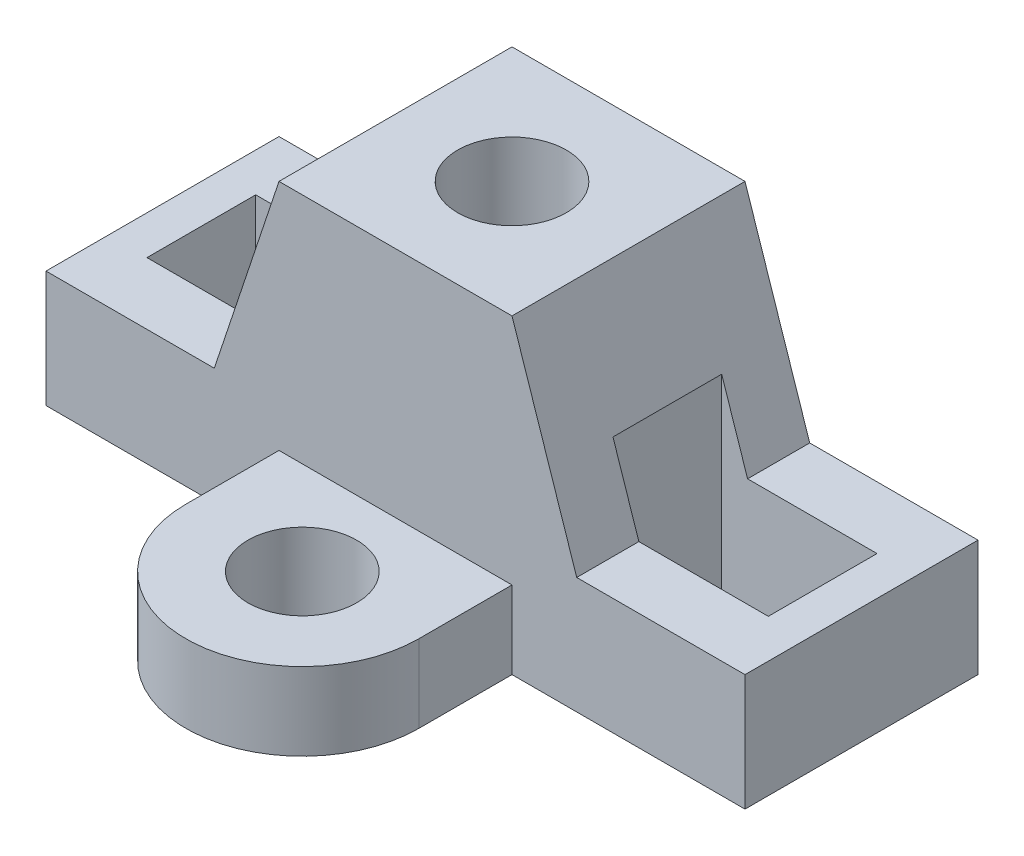
ISO-10303-21;
HEADER;
FILE_DESCRIPTION(('STEP AP214'),'2;1');
FILE_NAME('part.step','',(''),(''),'','','');
FILE_SCHEMA(('AUTOMOTIVE_DESIGN { 1 0 10303 214 1 1 1 1 }'));
ENDSEC;
DATA;
#1=APPLICATION_CONTEXT('core data for automotive mechanical design processes');
#2=APPLICATION_PROTOCOL_DEFINITION('international standard','automotive_design',2000,#1);
#3=PRODUCT_CONTEXT('',#1,'mechanical');
#4=PRODUCT('Part','Part','',(#3));
#5=PRODUCT_RELATED_PRODUCT_CATEGORY('part','',(#4));
#6=PRODUCT_DEFINITION_FORMATION('','',#4);
#7=PRODUCT_DEFINITION_CONTEXT('part definition',#1,'design');
#8=PRODUCT_DEFINITION('design','',#6,#7);
#9=PRODUCT_DEFINITION_SHAPE('','',#8);
#10=(LENGTH_UNIT() NAMED_UNIT(*) SI_UNIT(.MILLI.,.METRE.));
#11=(NAMED_UNIT(*) PLANE_ANGLE_UNIT() SI_UNIT($,.RADIAN.));
#12=(NAMED_UNIT(*) SI_UNIT($,.STERADIAN.) SOLID_ANGLE_UNIT());
#13=UNCERTAINTY_MEASURE_WITH_UNIT(LENGTH_MEASURE(1.E-05),#10,'distance_accuracy_value','');
#14=(GEOMETRIC_REPRESENTATION_CONTEXT(3) GLOBAL_UNCERTAINTY_ASSIGNED_CONTEXT((#13)) GLOBAL_UNIT_ASSIGNED_CONTEXT((#10,
#11,#12)) REPRESENTATION_CONTEXT('',''));
#15=CARTESIAN_POINT('',(0.,0.,0.));
#16=DIRECTION('',(0.,0.,1.));
#17=DIRECTION('',(1.,0.,0.));
#18=AXIS2_PLACEMENT_3D('',#15,#16,#17);
#19=CARTESIAN_POINT('',(15.,10.,0.));
#20=DIRECTION('',(-1.,0.,0.));
#21=DIRECTION('',(0.,0.,1.));
#22=AXIS2_PLACEMENT_3D('',#19,#20,#21);
#23=PLANE('',#22);
#24=DIRECTION('',(0.,-1.,0.));
#25=VECTOR('',#24,1.);
#26=CARTESIAN_POINT('',(15.,40.,-12.));
#27=LINE('',#26,#25);
#28=CARTESIAN_POINT('',(15.,10.,-12.));
#29=VERTEX_POINT('',#28);
#30=CARTESIAN_POINT('',(15.,0.,-12.));
#31=VERTEX_POINT('',#30);
#32=EDGE_CURVE('E268',#29,#31,#27,.T.);
#33=ORIENTED_EDGE('',*,*,#32,.F.);
#34=DIRECTION('',(0.,0.,-1.));
#35=VECTOR('',#34,1.);
#36=CARTESIAN_POINT('',(15.,10.,0.));
#37=LINE('',#36,#35);
#38=CARTESIAN_POINT('',(15.,10.,0.));
#39=VERTEX_POINT('',#38);
#40=EDGE_CURVE('E326',#39,#29,#37,.T.);
#41=ORIENTED_EDGE('',*,*,#40,.F.);
#42=DIRECTION('',(0.,-1.,0.));
#43=VECTOR('',#42,1.);
#44=CARTESIAN_POINT('',(15.,10.,0.));
#45=LINE('',#44,#43);
#46=CARTESIAN_POINT('',(15.,0.,0.));
#47=VERTEX_POINT('',#46);
#48=EDGE_CURVE('E332',#39,#47,#45,.T.);
#49=ORIENTED_EDGE('',*,*,#48,.T.);
#50=DIRECTION('',(0.,0.,-1.));
#51=VECTOR('',#50,1.);
#52=CARTESIAN_POINT('',(15.,0.,0.));
#53=LINE('',#52,#51);
#54=EDGE_CURVE('E321',#47,#31,#53,.T.);
#55=ORIENTED_EDGE('',*,*,#54,.T.);
#56=EDGE_LOOP('',(#33,#41,#49,#55));
#57=FACE_BOUND('',#56,.T.);
#58=ADVANCED_FACE('F41',(#57),#23,.F.);
#59=CARTESIAN_POINT('',(-15.,10.,0.));
#60=DIRECTION('',(-1.,0.,0.));
#61=DIRECTION('',(0.,0.,1.));
#62=AXIS2_PLACEMENT_3D('',#59,#60,#61);
#63=PLANE('',#62);
#64=DIRECTION('',(0.,-1.,0.));
#65=VECTOR('',#64,1.);
#66=CARTESIAN_POINT('',(-15.,40.,-12.));
#67=LINE('',#66,#65);
#68=CARTESIAN_POINT('',(-15.,10.,-12.));
#69=VERTEX_POINT('',#68);
#70=CARTESIAN_POINT('',(-15.,0.,-12.));
#71=VERTEX_POINT('',#70);
#72=EDGE_CURVE('E300',#69,#71,#67,.T.);
#73=ORIENTED_EDGE('',*,*,#72,.T.);
#74=DIRECTION('',(0.,0.,-1.));
#75=VECTOR('',#74,1.);
#76=CARTESIAN_POINT('',(-15.,0.,0.));
#77=LINE('',#76,#75);
#78=CARTESIAN_POINT('',(-15.,0.,0.));
#79=VERTEX_POINT('',#78);
#80=EDGE_CURVE('E335',#79,#71,#77,.T.);
#81=ORIENTED_EDGE('',*,*,#80,.F.);
#82=DIRECTION('',(0.,-1.,0.));
#83=VECTOR('',#82,1.);
#84=CARTESIAN_POINT('',(-15.,10.,0.));
#85=LINE('',#84,#83);
#86=CARTESIAN_POINT('',(-15.,10.,0.));
#87=VERTEX_POINT('',#86);
#88=EDGE_CURVE('E344',#87,#79,#85,.T.);
#89=ORIENTED_EDGE('',*,*,#88,.F.);
#90=DIRECTION('',(0.,0.,-1.));
#91=VECTOR('',#90,1.);
#92=CARTESIAN_POINT('',(-15.,10.,0.));
#93=LINE('',#92,#91);
#94=EDGE_CURVE('E320',#87,#69,#93,.T.);
#95=ORIENTED_EDGE('',*,*,#94,.T.);
#96=EDGE_LOOP('',(#73,#81,#89,#95));
#97=FACE_BOUND('',#96,.T.);
#98=ADVANCED_FACE('F428',(#97),#63,.T.);
#99=CARTESIAN_POINT('',(0.,10.,0.));
#100=DIRECTION('',(0.,-1.,0.));
#101=DIRECTION('',(0.,0.,-1.));
#102=AXIS2_PLACEMENT_3D('',#99,#100,#101);
#103=CYLINDRICAL_SURFACE('',#102,15.);
#104=CARTESIAN_POINT('',(0.,0.,0.));
#105=DIRECTION('',(0.,1.,0.));
#106=DIRECTION('',(0.,0.,1.));
#107=AXIS2_PLACEMENT_3D('',#104,#105,#106);
#108=CIRCLE('',#107,15.);
#109=EDGE_CURVE('E338',#79,#47,#108,.T.);
#110=ORIENTED_EDGE('',*,*,#109,.T.);
#111=ORIENTED_EDGE('',*,*,#48,.F.);
#112=CARTESIAN_POINT('',(0.,10.,0.));
#113=DIRECTION('',(0.,1.,0.));
#114=DIRECTION('',(0.,0.,1.));
#115=AXIS2_PLACEMENT_3D('',#112,#113,#114);
#116=CIRCLE('',#115,15.);
#117=EDGE_CURVE('E323',#87,#39,#116,.T.);
#118=ORIENTED_EDGE('',*,*,#117,.F.);
#119=ORIENTED_EDGE('',*,*,#88,.T.);
#120=EDGE_LOOP('',(#110,#111,#118,#119));
#121=FACE_BOUND('',#120,.T.);
#122=ADVANCED_FACE('F433',(#121),#103,.T.);
#123=CARTESIAN_POINT('',(0.,10.,0.));
#124=DIRECTION('',(0.,-1.,0.));
#125=DIRECTION('',(0.,0.,-1.));
#126=AXIS2_PLACEMENT_3D('',#123,#124,#125);
#127=CYLINDRICAL_SURFACE('',#126,7.);
#128=CARTESIAN_POINT('',(0.,10.,0.));
#129=DIRECTION('',(0.,1.,0.));
#130=DIRECTION('',(0.,0.,1.));
#131=AXIS2_PLACEMENT_3D('',#128,#129,#130);
#132=CIRCLE('',#131,7.);
#133=CARTESIAN_POINT('',(0.,10.,7.));
#134=VERTEX_POINT('',#133);
#135=EDGE_CURVE('E317',#134,#134,#132,.T.);
#136=ORIENTED_EDGE('',*,*,#135,.T.);
#137=EDGE_LOOP('',(#136));
#138=FACE_BOUND('',#137,.T.);
#139=CARTESIAN_POINT('',(0.,0.,0.));
#140=DIRECTION('',(0.,1.,0.));
#141=DIRECTION('',(0.,0.,1.));
#142=AXIS2_PLACEMENT_3D('',#139,#140,#141);
#143=CIRCLE('',#142,7.);
#144=CARTESIAN_POINT('',(0.,0.,7.));
#145=VERTEX_POINT('',#144);
#146=EDGE_CURVE('E313',#145,#145,#143,.T.);
#147=ORIENTED_EDGE('',*,*,#146,.F.);
#148=EDGE_LOOP('',(#147));
#149=FACE_BOUND('',#148,.T.);
#150=ADVANCED_FACE('F423',(#138,#149),#127,.F.);
#151=CARTESIAN_POINT('',(0.,10.,0.));
#152=DIRECTION('',(0.,1.,0.));
#153=DIRECTION('',(0.,0.,1.));
#154=AXIS2_PLACEMENT_3D('',#151,#152,#153);
#155=PLANE('',#154);
#156=ORIENTED_EDGE('',*,*,#135,.F.);
#157=EDGE_LOOP('',(#156));
#158=FACE_BOUND('',#157,.T.);
#159=ORIENTED_EDGE('',*,*,#94,.F.);
#160=ORIENTED_EDGE('',*,*,#117,.T.);
#161=ORIENTED_EDGE('',*,*,#40,.T.);
#162=DIRECTION('',(1.,0.,0.));
#163=VECTOR('',#162,1.);
#164=CARTESIAN_POINT('',(0.,10.,-12.));
#165=LINE('',#164,#163);
#166=EDGE_CURVE('E329',#69,#29,#165,.T.);
#167=ORIENTED_EDGE('',*,*,#166,.F.);
#168=EDGE_LOOP('',(#159,#160,#161,#167));
#169=FACE_BOUND('',#168,.T.);
#170=ADVANCED_FACE('F416',(#158,#169),#155,.T.);
#171=CARTESIAN_POINT('',(0.,0.,0.));
#172=DIRECTION('',(0.,1.,0.));
#173=DIRECTION('',(0.,0.,1.));
#174=AXIS2_PLACEMENT_3D('',#171,#172,#173);
#175=PLANE('',#174);
#176=DIRECTION('',(1.,0.,0.));
#177=VECTOR('',#176,1.);
#178=CARTESIAN_POINT('',(0.,0.,-34.));
#179=LINE('',#178,#177);
#180=CARTESIAN_POINT('',(20.,0.,-34.));
#181=VERTEX_POINT('',#180);
#182=CARTESIAN_POINT('',(40.,0.,-34.));
#183=VERTEX_POINT('',#182);
#184=EDGE_CURVE('E226',#181,#183,#179,.T.);
#185=ORIENTED_EDGE('',*,*,#184,.F.);
#186=DIRECTION('',(0.,0.,-1.));
#187=VECTOR('',#186,1.);
#188=CARTESIAN_POINT('',(20.,0.,-20.));
#189=LINE('',#188,#187);
#190=CARTESIAN_POINT('',(20.,0.,-20.));
#191=VERTEX_POINT('',#190);
#192=EDGE_CURVE('E220',#191,#181,#189,.T.);
#193=ORIENTED_EDGE('',*,*,#192,.F.);
#194=DIRECTION('',(-1.,0.,0.));
#195=VECTOR('',#194,1.);
#196=CARTESIAN_POINT('',(0.,0.,-20.));
#197=LINE('',#196,#195);
#198=CARTESIAN_POINT('',(40.,0.,-20.));
#199=VERTEX_POINT('',#198);
#200=EDGE_CURVE('E251',#199,#191,#197,.T.);
#201=ORIENTED_EDGE('',*,*,#200,.F.);
#202=DIRECTION('',(0.,0.,1.));
#203=VECTOR('',#202,1.);
#204=CARTESIAN_POINT('',(40.,0.,0.));
#205=LINE('',#204,#203);
#206=EDGE_CURVE('E249',#183,#199,#205,.T.);
#207=ORIENTED_EDGE('',*,*,#206,.F.);
#208=EDGE_LOOP('',(#185,#193,#201,#207));
#209=FACE_BOUND('',#208,.T.);
#210=DIRECTION('',(1.,0.,0.));
#211=VECTOR('',#210,1.);
#212=CARTESIAN_POINT('',(0.,0.,-20.));
#213=LINE('',#212,#211);
#214=CARTESIAN_POINT('',(-40.,0.,-20.));
#215=VERTEX_POINT('',#214);
#216=CARTESIAN_POINT('',(-20.,0.,-20.));
#217=VERTEX_POINT('',#216);
#218=EDGE_CURVE('E218',#215,#217,#213,.T.);
#219=ORIENTED_EDGE('',*,*,#218,.T.);
#220=DIRECTION('',(0.,0.,1.));
#221=VECTOR('',#220,1.);
#222=CARTESIAN_POINT('',(-20.,0.,-20.));
#223=LINE('',#222,#221);
#224=CARTESIAN_POINT('',(-20.,0.,-34.));
#225=VERTEX_POINT('',#224);
#226=EDGE_CURVE('E210',#225,#217,#223,.T.);
#227=ORIENTED_EDGE('',*,*,#226,.F.);
#228=DIRECTION('',(1.,0.,0.));
#229=VECTOR('',#228,1.);
#230=CARTESIAN_POINT('',(0.,0.,-34.));
#231=LINE('',#230,#229);
#232=CARTESIAN_POINT('',(-40.,0.,-34.));
#233=VERTEX_POINT('',#232);
#234=EDGE_CURVE('E193',#233,#225,#231,.T.);
#235=ORIENTED_EDGE('',*,*,#234,.F.);
#236=DIRECTION('',(0.,0.,1.));
#237=VECTOR('',#236,1.);
#238=CARTESIAN_POINT('',(-40.,0.,0.));
#239=LINE('',#238,#237);
#240=EDGE_CURVE('E204',#233,#215,#239,.T.);
#241=ORIENTED_EDGE('',*,*,#240,.T.);
#242=EDGE_LOOP('',(#219,#227,#235,#241));
#243=FACE_BOUND('',#242,.T.);
#244=ORIENTED_EDGE('',*,*,#146,.T.);
#245=EDGE_LOOP('',(#244));
#246=FACE_BOUND('',#245,.T.);
#247=ORIENTED_EDGE('',*,*,#80,.T.);
#248=DIRECTION('',(-1.,0.,0.));
#249=VECTOR('',#248,1.);
#250=CARTESIAN_POINT('',(0.,0.,-12.));
#251=LINE('',#250,#249);
#252=CARTESIAN_POINT('',(-45.,0.,-12.));
#253=VERTEX_POINT('',#252);
#254=EDGE_CURVE('E298',#71,#253,#251,.T.);
#255=ORIENTED_EDGE('',*,*,#254,.T.);
#256=DIRECTION('',(0.,0.,-1.));
#257=VECTOR('',#256,1.);
#258=CARTESIAN_POINT('',(-45.,0.,0.));
#259=LINE('',#258,#257);
#260=CARTESIAN_POINT('',(-45.,0.,-42.));
#261=VERTEX_POINT('',#260);
#262=EDGE_CURVE('E203',#253,#261,#259,.T.);
#263=ORIENTED_EDGE('',*,*,#262,.T.);
#264=DIRECTION('',(1.,0.,0.));
#265=VECTOR('',#264,1.);
#266=CARTESIAN_POINT('',(0.,0.,-42.));
#267=LINE('',#266,#265);
#268=CARTESIAN_POINT('',(45.,0.,-42.));
#269=VERTEX_POINT('',#268);
#270=EDGE_CURVE('E307',#261,#269,#267,.T.);
#271=ORIENTED_EDGE('',*,*,#270,.T.);
#272=DIRECTION('',(0.,0.,1.));
#273=VECTOR('',#272,1.);
#274=CARTESIAN_POINT('',(45.,0.,0.));
#275=LINE('',#274,#273);
#276=CARTESIAN_POINT('',(45.,0.,-12.));
#277=VERTEX_POINT('',#276);
#278=EDGE_CURVE('E236',#269,#277,#275,.T.);
#279=ORIENTED_EDGE('',*,*,#278,.T.);
#280=DIRECTION('',(1.,0.,0.));
#281=VECTOR('',#280,1.);
#282=CARTESIAN_POINT('',(0.,0.,-12.));
#283=LINE('',#282,#281);
#284=EDGE_CURVE('E266',#31,#277,#283,.T.);
#285=ORIENTED_EDGE('',*,*,#284,.F.);
#286=ORIENTED_EDGE('',*,*,#54,.F.);
#287=ORIENTED_EDGE('',*,*,#109,.F.);
#288=EDGE_LOOP('',(#247,#255,#263,#271,#279,#285,#286,#287));
#289=FACE_BOUND('',#288,.T.);
#290=CARTESIAN_POINT('',(0.,0.,-27.));
#291=DIRECTION('',(0.,1.,0.));
#292=DIRECTION('',(0.,0.,1.));
#293=AXIS2_PLACEMENT_3D('',#290,#291,#292);
#294=CIRCLE('',#293,7.);
#295=CARTESIAN_POINT('',(0.,0.,-20.));
#296=VERTEX_POINT('',#295);
#297=EDGE_CURVE('E302',#296,#296,#294,.T.);
#298=ORIENTED_EDGE('',*,*,#297,.T.);
#299=EDGE_LOOP('',(#298));
#300=FACE_BOUND('',#299,.T.);
#301=ADVANCED_FACE('F215',(#209,#243,#246,#289,#300),#175,.F.);
#302=CARTESIAN_POINT('',(0.,40.,-12.));
#303=DIRECTION('',(0.,0.,-1.));
#304=DIRECTION('',(-1.,0.,0.));
#305=AXIS2_PLACEMENT_3D('',#302,#303,#304);
#306=PLANE('',#305);
#307=DIRECTION('',(1.,0.,0.));
#308=VECTOR('',#307,1.);
#309=CARTESIAN_POINT('',(0.,15.,-12.));
#310=LINE('',#309,#308);
#311=CARTESIAN_POINT('',(23.3333333333333,15.,-12.));
#312=VERTEX_POINT('',#311);
#313=CARTESIAN_POINT('',(45.,15.,-12.));
#314=VERTEX_POINT('',#313);
#315=EDGE_CURVE('E239',#312,#314,#310,.T.);
#316=ORIENTED_EDGE('',*,*,#315,.F.);
#317=DIRECTION('',(0.316227766016843,-0.948683298050512,0.));
#318=VECTOR('',#317,1.);
#319=CARTESIAN_POINT('',(25.,9.99999999999993,-12.));
#320=LINE('',#319,#318);
#321=CARTESIAN_POINT('',(14.9999999999998,40.,-12.));
#322=VERTEX_POINT('',#321);
#323=EDGE_CURVE('E349',#312,#322,#320,.F.);
#324=ORIENTED_EDGE('',*,*,#323,.T.);
#325=DIRECTION('',(1.,0.,0.));
#326=VECTOR('',#325,1.);
#327=CARTESIAN_POINT('',(0.,40.,-12.));
#328=LINE('',#327,#326);
#329=CARTESIAN_POINT('',(-15.,40.,-12.));
#330=VERTEX_POINT('',#329);
#331=EDGE_CURVE('E310',#330,#322,#328,.T.);
#332=ORIENTED_EDGE('',*,*,#331,.F.);
#333=DIRECTION('',(-0.316227766016836,-0.948683298050515,0.));
#334=VECTOR('',#333,1.);
#335=CARTESIAN_POINT('',(-15.,40.,-12.));
#336=LINE('',#335,#334);
#337=CARTESIAN_POINT('',(-23.3333333333332,15.,-12.));
#338=VERTEX_POINT('',#337);
#339=EDGE_CURVE('E346',#330,#338,#336,.T.);
#340=ORIENTED_EDGE('',*,*,#339,.T.);
#341=DIRECTION('',(-1.,0.,0.));
#342=VECTOR('',#341,1.);
#343=CARTESIAN_POINT('',(0.,15.,-12.));
#344=LINE('',#343,#342);
#345=CARTESIAN_POINT('',(-45.,15.,-12.));
#346=VERTEX_POINT('',#345);
#347=EDGE_CURVE('E282',#338,#346,#344,.T.);
#348=ORIENTED_EDGE('',*,*,#347,.T.);
#349=DIRECTION('',(0.,-1.,0.));
#350=VECTOR('',#349,1.);
#351=CARTESIAN_POINT('',(-45.,15.,-12.));
#352=LINE('',#351,#350);
#353=EDGE_CURVE('E285',#346,#253,#352,.T.);
#354=ORIENTED_EDGE('',*,*,#353,.T.);
#355=ORIENTED_EDGE('',*,*,#254,.F.);
#356=ORIENTED_EDGE('',*,*,#72,.F.);
#357=ORIENTED_EDGE('',*,*,#166,.T.);
#358=ORIENTED_EDGE('',*,*,#32,.T.);
#359=ORIENTED_EDGE('',*,*,#284,.T.);
#360=DIRECTION('',(0.,-1.,0.));
#361=VECTOR('',#360,1.);
#362=CARTESIAN_POINT('',(45.,15.,-12.));
#363=LINE('',#362,#361);
#364=EDGE_CURVE('E257',#314,#277,#363,.T.);
#365=ORIENTED_EDGE('',*,*,#364,.F.);
#366=EDGE_LOOP('',(#316,#324,#332,#340,#348,#354,#355,#356,#357,#358,#359,#365));
#367=FACE_BOUND('',#366,.T.);
#368=ADVANCED_FACE('F396',(#367),#306,.F.);
#369=CARTESIAN_POINT('',(0.,40.,-42.));
#370=DIRECTION('',(0.,0.,-1.));
#371=DIRECTION('',(-1.,0.,0.));
#372=AXIS2_PLACEMENT_3D('',#369,#370,#371);
#373=PLANE('',#372);
#374=DIRECTION('',(-0.316227766016843,0.948683298050512,0.));
#375=VECTOR('',#374,1.);
#376=CARTESIAN_POINT('',(13.4999999999998,44.5,-42.));
#377=LINE('',#376,#375);
#378=CARTESIAN_POINT('',(14.9999999999998,40.,-42.));
#379=VERTEX_POINT('',#378);
#380=CARTESIAN_POINT('',(23.3333333333333,15.,-42.));
#381=VERTEX_POINT('',#380);
#382=EDGE_CURVE('E358',#379,#381,#377,.F.);
#383=ORIENTED_EDGE('',*,*,#382,.T.);
#384=DIRECTION('',(1.,0.,0.));
#385=VECTOR('',#384,1.);
#386=CARTESIAN_POINT('',(0.,15.,-42.));
#387=LINE('',#386,#385);
#388=CARTESIAN_POINT('',(45.,15.,-42.));
#389=VERTEX_POINT('',#388);
#390=EDGE_CURVE('E244',#381,#389,#387,.T.);
#391=ORIENTED_EDGE('',*,*,#390,.T.);
#392=DIRECTION('',(0.,-1.,0.));
#393=VECTOR('',#392,1.);
#394=CARTESIAN_POINT('',(45.,15.,-42.));
#395=LINE('',#394,#393);
#396=EDGE_CURVE('E247',#389,#269,#395,.T.);
#397=ORIENTED_EDGE('',*,*,#396,.T.);
#398=ORIENTED_EDGE('',*,*,#270,.F.);
#399=DIRECTION('',(0.,-1.,0.));
#400=VECTOR('',#399,1.);
#401=CARTESIAN_POINT('',(-45.,15.,-42.));
#402=LINE('',#401,#400);
#403=CARTESIAN_POINT('',(-45.,15.,-42.));
#404=VERTEX_POINT('',#403);
#405=EDGE_CURVE('E292',#404,#261,#402,.T.);
#406=ORIENTED_EDGE('',*,*,#405,.F.);
#407=DIRECTION('',(1.,0.,0.));
#408=VECTOR('',#407,1.);
#409=CARTESIAN_POINT('',(0.,15.,-42.));
#410=LINE('',#409,#408);
#411=CARTESIAN_POINT('',(-23.3333333333332,15.,-42.));
#412=VERTEX_POINT('',#411);
#413=EDGE_CURVE('E277',#404,#412,#410,.T.);
#414=ORIENTED_EDGE('',*,*,#413,.T.);
#415=DIRECTION('',(0.316227766016836,0.948683298050515,0.));
#416=VECTOR('',#415,1.);
#417=CARTESIAN_POINT('',(-13.5,44.5,-42.));
#418=LINE('',#417,#416);
#419=CARTESIAN_POINT('',(-15.,40.,-42.));
#420=VERTEX_POINT('',#419);
#421=EDGE_CURVE('E356',#412,#420,#418,.T.);
#422=ORIENTED_EDGE('',*,*,#421,.T.);
#423=DIRECTION('',(1.,0.,0.));
#424=VECTOR('',#423,1.);
#425=CARTESIAN_POINT('',(0.,40.,-42.));
#426=LINE('',#425,#424);
#427=EDGE_CURVE('E306',#420,#379,#426,.T.);
#428=ORIENTED_EDGE('',*,*,#427,.T.);
#429=EDGE_LOOP('',(#383,#391,#397,#398,#406,#414,#422,#428));
#430=FACE_BOUND('',#429,.T.);
#431=ADVANCED_FACE('F402',(#430),#373,.T.);
#432=CARTESIAN_POINT('',(0.,40.,-27.));
#433=DIRECTION('',(0.,-1.,0.));
#434=DIRECTION('',(0.,0.,-1.));
#435=AXIS2_PLACEMENT_3D('',#432,#433,#434);
#436=CYLINDRICAL_SURFACE('',#435,7.);
#437=CARTESIAN_POINT('',(0.,40.,-27.));
#438=DIRECTION('',(0.,1.,0.));
#439=DIRECTION('',(0.,0.,1.));
#440=AXIS2_PLACEMENT_3D('',#437,#438,#439);
#441=CIRCLE('',#440,7.);
#442=CARTESIAN_POINT('',(0.,40.,-20.));
#443=VERTEX_POINT('',#442);
#444=EDGE_CURVE('E303',#443,#443,#441,.T.);
#445=ORIENTED_EDGE('',*,*,#444,.T.);
#446=EDGE_LOOP('',(#445));
#447=FACE_BOUND('',#446,.T.);
#448=ORIENTED_EDGE('',*,*,#297,.F.);
#449=EDGE_LOOP('',(#448));
#450=FACE_BOUND('',#449,.T.);
#451=ADVANCED_FACE('F484',(#447,#450),#436,.F.);
#452=CARTESIAN_POINT('',(0.,40.,0.));
#453=DIRECTION('',(0.,1.,0.));
#454=DIRECTION('',(0.,0.,1.));
#455=AXIS2_PLACEMENT_3D('',#452,#453,#454);
#456=PLANE('',#455);
#457=ORIENTED_EDGE('',*,*,#444,.F.);
#458=EDGE_LOOP('',(#457));
#459=FACE_BOUND('',#458,.T.);
#460=ORIENTED_EDGE('',*,*,#331,.T.);
#461=DIRECTION('',(0.,0.,-1.));
#462=VECTOR('',#461,1.);
#463=CARTESIAN_POINT('',(14.9999999999998,40.,0.));
#464=LINE('',#463,#462);
#465=EDGE_CURVE('E354',#322,#379,#464,.T.);
#466=ORIENTED_EDGE('',*,*,#465,.T.);
#467=ORIENTED_EDGE('',*,*,#427,.F.);
#468=DIRECTION('',(0.,0.,1.));
#469=VECTOR('',#468,1.);
#470=CARTESIAN_POINT('',(-15.,40.,-12.));
#471=LINE('',#470,#469);
#472=EDGE_CURVE('E351',#420,#330,#471,.T.);
#473=ORIENTED_EDGE('',*,*,#472,.T.);
#474=EDGE_LOOP('',(#460,#466,#467,#473));
#475=FACE_BOUND('',#474,.T.);
#476=ADVANCED_FACE('F481',(#459,#475),#456,.T.);
#477=CARTESIAN_POINT('',(0.,15.,-20.));
#478=DIRECTION('',(0.,0.,-1.));
#479=DIRECTION('',(-1.,0.,0.));
#480=AXIS2_PLACEMENT_3D('',#477,#478,#479);
#481=PLANE('',#480);
#482=DIRECTION('',(0.,-1.,0.));
#483=VECTOR('',#482,1.);
#484=CARTESIAN_POINT('',(-20.,40.,-20.));
#485=LINE('',#484,#483);
#486=CARTESIAN_POINT('',(-20.,24.9999999999998,-20.));
#487=VERTEX_POINT('',#486);
#488=EDGE_CURVE('E213',#487,#217,#485,.T.);
#489=ORIENTED_EDGE('',*,*,#488,.T.);
#490=ORIENTED_EDGE('',*,*,#218,.F.);
#491=DIRECTION('',(0.,-1.,0.));
#492=VECTOR('',#491,1.);
#493=CARTESIAN_POINT('',(-40.,15.,-20.));
#494=LINE('',#493,#492);
#495=CARTESIAN_POINT('',(-40.,15.,-20.));
#496=VERTEX_POINT('',#495);
#497=EDGE_CURVE('E296',#496,#215,#494,.T.);
#498=ORIENTED_EDGE('',*,*,#497,.F.);
#499=DIRECTION('',(1.,0.,0.));
#500=VECTOR('',#499,1.);
#501=CARTESIAN_POINT('',(0.,15.,-20.));
#502=LINE('',#501,#500);
#503=CARTESIAN_POINT('',(-23.3333333333332,15.,-20.));
#504=VERTEX_POINT('',#503);
#505=EDGE_CURVE('E271',#496,#504,#502,.T.);
#506=ORIENTED_EDGE('',*,*,#505,.T.);
#507=DIRECTION('',(0.316227766016836,0.948683298050515,0.));
#508=VECTOR('',#507,1.);
#509=CARTESIAN_POINT('',(-15.,40.,-20.));
#510=LINE('',#509,#508);
#511=EDGE_CURVE('E374',#504,#487,#510,.T.);
#512=ORIENTED_EDGE('',*,*,#511,.T.);
#513=EDGE_LOOP('',(#489,#490,#498,#506,#512));
#514=FACE_BOUND('',#513,.T.);
#515=ADVANCED_FACE('F477',(#514),#481,.T.);
#516=CARTESIAN_POINT('',(-40.,15.,0.));
#517=DIRECTION('',(1.,0.,0.));
#518=DIRECTION('',(0.,0.,-1.));
#519=AXIS2_PLACEMENT_3D('',#516,#517,#518);
#520=PLANE('',#519);
#521=ORIENTED_EDGE('',*,*,#240,.F.);
#522=DIRECTION('',(0.,-1.,0.));
#523=VECTOR('',#522,1.);
#524=CARTESIAN_POINT('',(-40.,15.,-34.));
#525=LINE('',#524,#523);
#526=CARTESIAN_POINT('',(-40.,15.,-34.));
#527=VERTEX_POINT('',#526);
#528=EDGE_CURVE('E198',#527,#233,#525,.T.);
#529=ORIENTED_EDGE('',*,*,#528,.F.);
#530=DIRECTION('',(0.,0.,1.));
#531=VECTOR('',#530,1.);
#532=CARTESIAN_POINT('',(-40.,15.,0.));
#533=LINE('',#532,#531);
#534=EDGE_CURVE('E273',#527,#496,#533,.T.);
#535=ORIENTED_EDGE('',*,*,#534,.T.);
#536=ORIENTED_EDGE('',*,*,#497,.T.);
#537=EDGE_LOOP('',(#521,#529,#535,#536));
#538=FACE_BOUND('',#537,.T.);
#539=ADVANCED_FACE('F474',(#538),#520,.T.);
#540=CARTESIAN_POINT('',(0.,15.,-34.));
#541=DIRECTION('',(0.,0.,-1.));
#542=DIRECTION('',(-1.,0.,0.));
#543=AXIS2_PLACEMENT_3D('',#540,#541,#542);
#544=PLANE('',#543);
#545=ORIENTED_EDGE('',*,*,#234,.T.);
#546=DIRECTION('',(0.,-1.,0.));
#547=VECTOR('',#546,1.);
#548=CARTESIAN_POINT('',(-20.,40.,-34.));
#549=LINE('',#548,#547);
#550=CARTESIAN_POINT('',(-20.,24.9999999999998,-34.));
#551=VERTEX_POINT('',#550);
#552=EDGE_CURVE('E196',#551,#225,#549,.T.);
#553=ORIENTED_EDGE('',*,*,#552,.F.);
#554=DIRECTION('',(-0.316227766016836,-0.948683298050515,0.));
#555=VECTOR('',#554,1.);
#556=CARTESIAN_POINT('',(-15.,40.,-34.));
#557=LINE('',#556,#555);
#558=CARTESIAN_POINT('',(-23.3333333333332,15.,-34.));
#559=VERTEX_POINT('',#558);
#560=EDGE_CURVE('E371',#551,#559,#557,.T.);
#561=ORIENTED_EDGE('',*,*,#560,.T.);
#562=DIRECTION('',(1.,0.,0.));
#563=VECTOR('',#562,1.);
#564=CARTESIAN_POINT('',(0.,15.,-34.));
#565=LINE('',#564,#563);
#566=EDGE_CURVE('E57',#527,#559,#565,.T.);
#567=ORIENTED_EDGE('',*,*,#566,.F.);
#568=ORIENTED_EDGE('',*,*,#528,.T.);
#569=EDGE_LOOP('',(#545,#553,#561,#567,#568));
#570=FACE_BOUND('',#569,.T.);
#571=ADVANCED_FACE('F195',(#570),#544,.F.);
#572=CARTESIAN_POINT('',(-45.,15.,0.));
#573=DIRECTION('',(-1.,0.,0.));
#574=DIRECTION('',(0.,0.,1.));
#575=AXIS2_PLACEMENT_3D('',#572,#573,#574);
#576=PLANE('',#575);
#577=ORIENTED_EDGE('',*,*,#262,.F.);
#578=ORIENTED_EDGE('',*,*,#353,.F.);
#579=DIRECTION('',(0.,0.,-1.));
#580=VECTOR('',#579,1.);
#581=CARTESIAN_POINT('',(-45.,15.,0.));
#582=LINE('',#581,#580);
#583=EDGE_CURVE('E279',#346,#404,#582,.T.);
#584=ORIENTED_EDGE('',*,*,#583,.T.);
#585=ORIENTED_EDGE('',*,*,#405,.T.);
#586=EDGE_LOOP('',(#577,#578,#584,#585));
#587=FACE_BOUND('',#586,.T.);
#588=ADVANCED_FACE('F468',(#587),#576,.T.);
#589=CARTESIAN_POINT('',(0.,15.,0.));
#590=DIRECTION('',(0.,1.,0.));
#591=DIRECTION('',(0.,0.,1.));
#592=AXIS2_PLACEMENT_3D('',#589,#590,#591);
#593=PLANE('',#592);
#594=ORIENTED_EDGE('',*,*,#505,.F.);
#595=ORIENTED_EDGE('',*,*,#534,.F.);
#596=ORIENTED_EDGE('',*,*,#566,.T.);
#597=DIRECTION('',(0.,0.,-1.));
#598=VECTOR('',#597,1.);
#599=CARTESIAN_POINT('',(-23.3333333333332,15.,0.));
#600=LINE('',#599,#598);
#601=EDGE_CURVE('E369',#559,#412,#600,.T.);
#602=ORIENTED_EDGE('',*,*,#601,.T.);
#603=ORIENTED_EDGE('',*,*,#413,.F.);
#604=ORIENTED_EDGE('',*,*,#583,.F.);
#605=ORIENTED_EDGE('',*,*,#347,.F.);
#606=DIRECTION('',(0.,0.,-1.));
#607=VECTOR('',#606,1.);
#608=CARTESIAN_POINT('',(-23.3333333333332,15.,0.));
#609=LINE('',#608,#607);
#610=EDGE_CURVE('E366',#338,#504,#609,.T.);
#611=ORIENTED_EDGE('',*,*,#610,.T.);
#612=EDGE_LOOP('',(#594,#595,#596,#602,#603,#604,#605,#611));
#613=FACE_BOUND('',#612,.T.);
#614=ADVANCED_FACE('F465',(#613),#593,.T.);
#615=CARTESIAN_POINT('',(0.,15.,-34.));
#616=DIRECTION('',(0.,0.,-1.));
#617=DIRECTION('',(-1.,0.,0.));
#618=AXIS2_PLACEMENT_3D('',#615,#616,#617);
#619=PLANE('',#618);
#620=DIRECTION('',(0.,-1.,0.));
#621=VECTOR('',#620,1.);
#622=CARTESIAN_POINT('',(40.,15.,-34.));
#623=LINE('',#622,#621);
#624=CARTESIAN_POINT('',(40.,15.,-34.));
#625=VERTEX_POINT('',#624);
#626=EDGE_CURVE('E263',#625,#183,#623,.T.);
#627=ORIENTED_EDGE('',*,*,#626,.F.);
#628=DIRECTION('',(1.,0.,0.));
#629=VECTOR('',#628,1.);
#630=CARTESIAN_POINT('',(0.,15.,-34.));
#631=LINE('',#630,#629);
#632=CARTESIAN_POINT('',(23.3333333333333,15.,-34.));
#633=VERTEX_POINT('',#632);
#634=EDGE_CURVE('E233',#633,#625,#631,.T.);
#635=ORIENTED_EDGE('',*,*,#634,.F.);
#636=DIRECTION('',(0.316227766016843,-0.948683298050512,0.));
#637=VECTOR('',#636,1.);
#638=CARTESIAN_POINT('',(25.,9.99999999999993,-34.));
#639=LINE('',#638,#637);
#640=CARTESIAN_POINT('',(20.,24.9999999999997,-34.));
#641=VERTEX_POINT('',#640);
#642=EDGE_CURVE('E11',#633,#641,#639,.F.);
#643=ORIENTED_EDGE('',*,*,#642,.T.);
#644=DIRECTION('',(0.,-1.,0.));
#645=VECTOR('',#644,1.);
#646=CARTESIAN_POINT('',(20.,40.,-34.));
#647=LINE('',#646,#645);
#648=EDGE_CURVE('E230',#641,#181,#647,.T.);
#649=ORIENTED_EDGE('',*,*,#648,.T.);
#650=ORIENTED_EDGE('',*,*,#184,.T.);
#651=EDGE_LOOP('',(#627,#635,#643,#649,#650));
#652=FACE_BOUND('',#651,.T.);
#653=ADVANCED_FACE('F408',(#652),#619,.F.);
#654=CARTESIAN_POINT('',(40.,15.,0.));
#655=DIRECTION('',(1.,0.,0.));
#656=DIRECTION('',(0.,0.,-1.));
#657=AXIS2_PLACEMENT_3D('',#654,#655,#656);
#658=PLANE('',#657);
#659=ORIENTED_EDGE('',*,*,#206,.T.);
#660=DIRECTION('',(0.,-1.,0.));
#661=VECTOR('',#660,1.);
#662=CARTESIAN_POINT('',(40.,15.,-20.));
#663=LINE('',#662,#661);
#664=CARTESIAN_POINT('',(40.,15.,-20.));
#665=VERTEX_POINT('',#664);
#666=EDGE_CURVE('E260',#665,#199,#663,.T.);
#667=ORIENTED_EDGE('',*,*,#666,.F.);
#668=DIRECTION('',(0.,0.,1.));
#669=VECTOR('',#668,1.);
#670=CARTESIAN_POINT('',(40.,15.,0.));
#671=LINE('',#670,#669);
#672=EDGE_CURVE('E235',#625,#665,#671,.T.);
#673=ORIENTED_EDGE('',*,*,#672,.F.);
#674=ORIENTED_EDGE('',*,*,#626,.T.);
#675=EDGE_LOOP('',(#659,#667,#673,#674));
#676=FACE_BOUND('',#675,.T.);
#677=ADVANCED_FACE('F413',(#676),#658,.F.);
#678=CARTESIAN_POINT('',(0.,15.,-20.));
#679=DIRECTION('',(0.,0.,1.));
#680=DIRECTION('',(1.,0.,0.));
#681=AXIS2_PLACEMENT_3D('',#678,#679,#680);
#682=PLANE('',#681);
#683=ORIENTED_EDGE('',*,*,#200,.T.);
#684=DIRECTION('',(0.,-1.,0.));
#685=VECTOR('',#684,1.);
#686=CARTESIAN_POINT('',(20.,40.,-20.));
#687=LINE('',#686,#685);
#688=CARTESIAN_POINT('',(20.,24.9999999999997,-20.));
#689=VERTEX_POINT('',#688);
#690=EDGE_CURVE('E223',#689,#191,#687,.T.);
#691=ORIENTED_EDGE('',*,*,#690,.F.);
#692=DIRECTION('',(-0.316227766016843,0.948683298050512,0.));
#693=VECTOR('',#692,1.);
#694=CARTESIAN_POINT('',(25.,9.99999999999993,-20.));
#695=LINE('',#694,#693);
#696=CARTESIAN_POINT('',(23.3333333333333,15.,-20.));
#697=VERTEX_POINT('',#696);
#698=EDGE_CURVE('E376',#689,#697,#695,.F.);
#699=ORIENTED_EDGE('',*,*,#698,.T.);
#700=DIRECTION('',(-1.,0.,0.));
#701=VECTOR('',#700,1.);
#702=CARTESIAN_POINT('',(0.,15.,-20.));
#703=LINE('',#702,#701);
#704=EDGE_CURVE('E65',#665,#697,#703,.T.);
#705=ORIENTED_EDGE('',*,*,#704,.F.);
#706=ORIENTED_EDGE('',*,*,#666,.T.);
#707=EDGE_LOOP('',(#683,#691,#699,#705,#706));
#708=FACE_BOUND('',#707,.T.);
#709=ADVANCED_FACE('F386',(#708),#682,.F.);
#710=CARTESIAN_POINT('',(45.,15.,0.));
#711=DIRECTION('',(1.,0.,0.));
#712=DIRECTION('',(0.,0.,-1.));
#713=AXIS2_PLACEMENT_3D('',#710,#711,#712);
#714=PLANE('',#713);
#715=ORIENTED_EDGE('',*,*,#278,.F.);
#716=ORIENTED_EDGE('',*,*,#396,.F.);
#717=DIRECTION('',(0.,0.,1.));
#718=VECTOR('',#717,1.);
#719=CARTESIAN_POINT('',(45.,15.,0.));
#720=LINE('',#719,#718);
#721=EDGE_CURVE('E241',#389,#314,#720,.T.);
#722=ORIENTED_EDGE('',*,*,#721,.T.);
#723=ORIENTED_EDGE('',*,*,#364,.T.);
#724=EDGE_LOOP('',(#715,#716,#722,#723));
#725=FACE_BOUND('',#724,.T.);
#726=ADVANCED_FACE('F400',(#725),#714,.T.);
#727=CARTESIAN_POINT('',(0.,15.,0.));
#728=DIRECTION('',(0.,1.,0.));
#729=DIRECTION('',(0.,0.,1.));
#730=AXIS2_PLACEMENT_3D('',#727,#728,#729);
#731=PLANE('',#730);
#732=ORIENTED_EDGE('',*,*,#390,.F.);
#733=DIRECTION('',(0.,0.,-1.));
#734=VECTOR('',#733,1.);
#735=CARTESIAN_POINT('',(23.3333333333333,15.,0.));
#736=LINE('',#735,#734);
#737=EDGE_CURVE('E363',#381,#633,#736,.F.);
#738=ORIENTED_EDGE('',*,*,#737,.T.);
#739=ORIENTED_EDGE('',*,*,#634,.T.);
#740=ORIENTED_EDGE('',*,*,#672,.T.);
#741=ORIENTED_EDGE('',*,*,#704,.T.);
#742=DIRECTION('',(0.,0.,-1.));
#743=VECTOR('',#742,1.);
#744=CARTESIAN_POINT('',(23.3333333333333,15.,0.));
#745=LINE('',#744,#743);
#746=EDGE_CURVE('E361',#697,#312,#745,.F.);
#747=ORIENTED_EDGE('',*,*,#746,.T.);
#748=ORIENTED_EDGE('',*,*,#315,.T.);
#749=ORIENTED_EDGE('',*,*,#721,.F.);
#750=EDGE_LOOP('',(#732,#738,#739,#740,#741,#747,#748,#749));
#751=FACE_BOUND('',#750,.T.);
#752=ADVANCED_FACE('F392',(#751),#731,.T.);
#753=CARTESIAN_POINT('',(25.,9.99999999999993,0.));
#754=DIRECTION('',(-0.948683298050512,-0.316227766016843,0.));
#755=DIRECTION('',(0.,0.,1.));
#756=AXIS2_PLACEMENT_3D('',#753,#754,#755);
#757=PLANE('',#756);
#758=ORIENTED_EDGE('',*,*,#642,.F.);
#759=ORIENTED_EDGE('',*,*,#737,.F.);
#760=ORIENTED_EDGE('',*,*,#382,.F.);
#761=ORIENTED_EDGE('',*,*,#465,.F.);
#762=ORIENTED_EDGE('',*,*,#323,.F.);
#763=ORIENTED_EDGE('',*,*,#746,.F.);
#764=ORIENTED_EDGE('',*,*,#698,.F.);
#765=DIRECTION('',(0.,0.,-1.));
#766=VECTOR('',#765,1.);
#767=CARTESIAN_POINT('',(20.,24.9999999999997,0.));
#768=LINE('',#767,#766);
#769=EDGE_CURVE('E50',#641,#689,#768,.F.);
#770=ORIENTED_EDGE('',*,*,#769,.F.);
#771=EDGE_LOOP('',(#758,#759,#760,#761,#762,#763,#764,#770));
#772=FACE_BOUND('',#771,.T.);
#773=ADVANCED_FACE('F389',(#772),#757,.F.);
#774=CARTESIAN_POINT('',(-15.,40.,0.));
#775=DIRECTION('',(-0.948683298050515,0.316227766016836,0.));
#776=DIRECTION('',(0.,0.,-1.));
#777=AXIS2_PLACEMENT_3D('',#774,#775,#776);
#778=PLANE('',#777);
#779=ORIENTED_EDGE('',*,*,#511,.F.);
#780=ORIENTED_EDGE('',*,*,#610,.F.);
#781=ORIENTED_EDGE('',*,*,#339,.F.);
#782=ORIENTED_EDGE('',*,*,#472,.F.);
#783=ORIENTED_EDGE('',*,*,#421,.F.);
#784=ORIENTED_EDGE('',*,*,#601,.F.);
#785=ORIENTED_EDGE('',*,*,#560,.F.);
#786=DIRECTION('',(0.,0.,-1.));
#787=VECTOR('',#786,1.);
#788=CARTESIAN_POINT('',(-20.,24.9999999999998,0.));
#789=LINE('',#788,#787);
#790=EDGE_CURVE('E212',#487,#551,#789,.T.);
#791=ORIENTED_EDGE('',*,*,#790,.F.);
#792=EDGE_LOOP('',(#779,#780,#781,#782,#783,#784,#785,#791));
#793=FACE_BOUND('',#792,.T.);
#794=ADVANCED_FACE('F44',(#793),#778,.T.);
#795=CARTESIAN_POINT('',(-20.,40.,-20.));
#796=DIRECTION('',(1.,0.,0.));
#797=DIRECTION('',(0.,0.,-1.));
#798=AXIS2_PLACEMENT_3D('',#795,#796,#797);
#799=PLANE('',#798);
#800=ORIENTED_EDGE('',*,*,#790,.T.);
#801=ORIENTED_EDGE('',*,*,#552,.T.);
#802=ORIENTED_EDGE('',*,*,#226,.T.);
#803=ORIENTED_EDGE('',*,*,#488,.F.);
#804=EDGE_LOOP('',(#800,#801,#802,#803));
#805=FACE_BOUND('',#804,.T.);
#806=ADVANCED_FACE('F208',(#805),#799,.F.);
#807=CARTESIAN_POINT('',(20.,40.,-20.));
#808=DIRECTION('',(-1.,0.,0.));
#809=DIRECTION('',(0.,0.,1.));
#810=AXIS2_PLACEMENT_3D('',#807,#808,#809);
#811=PLANE('',#810);
#812=ORIENTED_EDGE('',*,*,#769,.T.);
#813=ORIENTED_EDGE('',*,*,#690,.T.);
#814=ORIENTED_EDGE('',*,*,#192,.T.);
#815=ORIENTED_EDGE('',*,*,#648,.F.);
#816=EDGE_LOOP('',(#812,#813,#814,#815));
#817=FACE_BOUND('',#816,.T.);
#818=ADVANCED_FACE('F381',(#817),#811,.F.);
#819=CLOSED_SHELL('',(#58,#98,#122,#150,#170,#301,#368,#431,#451,#476,#515,#539,#571,#588,#614,
#653,#677,#709,#726,#752,#773,#794,#806,#818));
#820=MANIFOLD_SOLID_BREP('B2',#819);
#821=ADVANCED_BREP_SHAPE_REPRESENTATION('',(#18,#820),#14);
#822=SHAPE_DEFINITION_REPRESENTATION(#9,#821);
ENDSEC;
END-ISO-10303-21;
